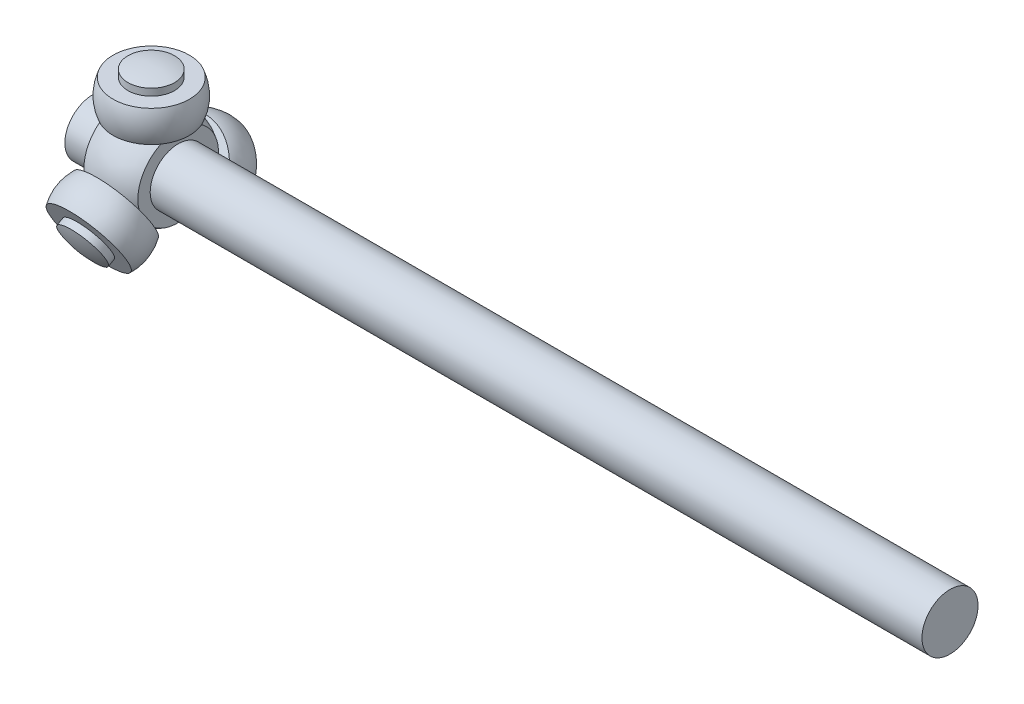
ISO-10303-21;
HEADER;
FILE_DESCRIPTION(('STEP AP214'),'2;1');
FILE_NAME('part.step','',(''),(''),'','','');
FILE_SCHEMA(('AUTOMOTIVE_DESIGN { 1 0 10303 214 1 1 1 1 }'));
ENDSEC;
DATA;
#1=APPLICATION_CONTEXT('core data for automotive mechanical design processes');
#2=APPLICATION_PROTOCOL_DEFINITION('international standard','automotive_design',2000,#1);
#3=PRODUCT_CONTEXT('',#1,'mechanical');
#4=PRODUCT('Part','Part','',(#3));
#5=PRODUCT_RELATED_PRODUCT_CATEGORY('part','',(#4));
#6=PRODUCT_DEFINITION_FORMATION('','',#4);
#7=PRODUCT_DEFINITION_CONTEXT('part definition',#1,'design');
#8=PRODUCT_DEFINITION('design','',#6,#7);
#9=PRODUCT_DEFINITION_SHAPE('','',#8);
#10=(LENGTH_UNIT() NAMED_UNIT(*) SI_UNIT(.MILLI.,.METRE.));
#11=(NAMED_UNIT(*) PLANE_ANGLE_UNIT() SI_UNIT($,.RADIAN.));
#12=(NAMED_UNIT(*) SI_UNIT($,.STERADIAN.) SOLID_ANGLE_UNIT());
#13=UNCERTAINTY_MEASURE_WITH_UNIT(LENGTH_MEASURE(1.E-05),#10,'distance_accuracy_value','');
#14=(GEOMETRIC_REPRESENTATION_CONTEXT(3) GLOBAL_UNCERTAINTY_ASSIGNED_CONTEXT((#13)) GLOBAL_UNIT_ASSIGNED_CONTEXT((#10,
#11,#12)) REPRESENTATION_CONTEXT('',''));
#15=CARTESIAN_POINT('',(0.,0.,0.));
#16=DIRECTION('',(0.,0.,1.));
#17=DIRECTION('',(1.,0.,0.));
#18=AXIS2_PLACEMENT_3D('',#15,#16,#17);
#19=CARTESIAN_POINT('',(0.,0.,0.));
#20=DIRECTION('',(-1.,0.,0.));
#21=DIRECTION('',(0.,1.,0.));
#22=AXIS2_PLACEMENT_3D('',#19,#20,#21);
#23=SPHERICAL_SURFACE('',#22,15.5769230769231);
#24=CARTESIAN_POINT('',(0.,-6.55500000000005,-11.353593043614));
#25=DIRECTION('',(0.,-0.500000000000004,-0.866025403784436));
#26=DIRECTION('',(0.,0.866025403784436,-0.500000000000004));
#27=AXIS2_PLACEMENT_3D('',#24,#25,#26);
#28=CIRCLE('',#27,8.41239755030506);
#29=CARTESIAN_POINT('',(0.,0.730349985298088,-15.5597918187665));
#30=VERTEX_POINT('',#29);
#31=EDGE_CURVE('E73',#30,#30,#28,.T.);
#32=ORIENTED_EDGE('',*,*,#31,.F.);
#33=EDGE_LOOP('',(#32));
#34=FACE_BOUND('',#33,.T.);
#35=CARTESIAN_POINT('',(0.,-6.55499999999989,11.353593043614));
#36=DIRECTION('',(0.,-0.499999999999992,0.866025403784443));
#37=DIRECTION('',(0.,-0.866025403784443,-0.499999999999992));
#38=AXIS2_PLACEMENT_3D('',#35,#36,#37);
#39=CIRCLE('',#38,8.41239755030507);
#40=CARTESIAN_POINT('',(0.,-13.8403499852981,7.14739426846158));
#41=VERTEX_POINT('',#40);
#42=EDGE_CURVE('E85',#41,#41,#39,.T.);
#43=ORIENTED_EDGE('',*,*,#42,.F.);
#44=EDGE_LOOP('',(#43));
#45=FACE_BOUND('',#44,.T.);
#46=CARTESIAN_POINT('',(0.,13.11,0.));
#47=DIRECTION('',(0.,1.,0.));
#48=DIRECTION('',(0.,0.,1.));
#49=AXIS2_PLACEMENT_3D('',#46,#47,#48);
#50=CIRCLE('',#49,8.41239755030507);
#51=CARTESIAN_POINT('',(0.,13.11,8.41239755030507));
#52=VERTEX_POINT('',#51);
#53=EDGE_CURVE('E55',#52,#52,#50,.T.);
#54=ORIENTED_EDGE('',*,*,#53,.F.);
#55=EDGE_LOOP('',(#54));
#56=FACE_BOUND('',#55,.T.);
#57=CARTESIAN_POINT('',(-8.65384615384615,0.,0.));
#58=DIRECTION('',(-1.,0.,0.));
#59=DIRECTION('',(0.,0.,1.));
#60=AXIS2_PLACEMENT_3D('',#57,#58,#59);
#61=CIRCLE('',#60,12.9518909542175);
#62=CARTESIAN_POINT('',(-8.65384615384615,0.,12.9518909542175));
#63=VERTEX_POINT('',#62);
#64=EDGE_CURVE('E11',#63,#63,#61,.T.);
#65=ORIENTED_EDGE('',*,*,#64,.F.);
#66=EDGE_LOOP('',(#65));
#67=FACE_BOUND('',#66,.T.);
#68=CARTESIAN_POINT('',(8.65384615384615,0.,0.));
#69=DIRECTION('',(-1.,0.,0.));
#70=DIRECTION('',(0.,0.,1.));
#71=AXIS2_PLACEMENT_3D('',#68,#69,#70);
#72=CIRCLE('',#71,12.9518909542175);
#73=CARTESIAN_POINT('',(8.65384615384615,0.,12.9518909542175));
#74=VERTEX_POINT('',#73);
#75=EDGE_CURVE('E46',#74,#74,#72,.T.);
#76=ORIENTED_EDGE('',*,*,#75,.T.);
#77=EDGE_LOOP('',(#76));
#78=FACE_BOUND('',#77,.T.);
#79=ADVANCED_FACE('F36',(#34,#45,#56,#67,#78),#23,.T.);
#80=CARTESIAN_POINT('',(-8.65384615384616,12.9518909542175,0.));
#81=DIRECTION('',(1.,0.,0.));
#82=DIRECTION('',(0.,0.,-1.));
#83=AXIS2_PLACEMENT_3D('',#80,#81,#82);
#84=PLANE('',#83);
#85=CARTESIAN_POINT('',(-8.65384615384615,0.,0.));
#86=DIRECTION('',(-1.,0.,0.));
#87=DIRECTION('',(0.,0.,1.));
#88=AXIS2_PLACEMENT_3D('',#85,#86,#87);
#89=CIRCLE('',#88,9.);
#90=CARTESIAN_POINT('',(-8.65384615384615,0.,9.));
#91=VERTEX_POINT('',#90);
#92=EDGE_CURVE('E42',#91,#91,#89,.T.);
#93=ORIENTED_EDGE('',*,*,#92,.F.);
#94=EDGE_LOOP('',(#93));
#95=FACE_BOUND('',#94,.T.);
#96=ORIENTED_EDGE('',*,*,#64,.T.);
#97=EDGE_LOOP('',(#96));
#98=FACE_BOUND('',#97,.T.);
#99=ADVANCED_FACE('F123',(#95,#98),#84,.F.);
#100=CARTESIAN_POINT('',(8.65384615384616,9.,0.));
#101=DIRECTION('',(-1.,0.,0.));
#102=DIRECTION('',(0.,0.,1.));
#103=AXIS2_PLACEMENT_3D('',#100,#101,#102);
#104=PLANE('',#103);
#105=ORIENTED_EDGE('',*,*,#75,.F.);
#106=EDGE_LOOP('',(#105));
#107=FACE_BOUND('',#106,.T.);
#108=CARTESIAN_POINT('',(8.65384615384615,0.,0.));
#109=DIRECTION('',(-1.,0.,0.));
#110=DIRECTION('',(0.,0.,1.));
#111=AXIS2_PLACEMENT_3D('',#108,#109,#110);
#112=CIRCLE('',#111,9.);
#113=CARTESIAN_POINT('',(8.65384615384615,0.,9.));
#114=VERTEX_POINT('',#113);
#115=EDGE_CURVE('E97',#114,#114,#112,.T.);
#116=ORIENTED_EDGE('',*,*,#115,.T.);
#117=EDGE_LOOP('',(#116));
#118=FACE_BOUND('',#117,.T.);
#119=ADVANCED_FACE('F128',(#107,#118),#104,.F.);
#120=CARTESIAN_POINT('',(0.,13.11,-7.47850270471022));
#121=DIRECTION('',(0.,1.,0.));
#122=DIRECTION('',(0.,0.,1.));
#123=AXIS2_PLACEMENT_3D('',#120,#121,#122);
#124=PLANE('',#123);
#125=CARTESIAN_POINT('',(0.,13.11,0.));
#126=DIRECTION('',(0.,1.,0.));
#127=DIRECTION('',(0.,0.,1.));
#128=AXIS2_PLACEMENT_3D('',#125,#126,#127);
#129=CIRCLE('',#128,12.2540156683432);
#130=CARTESIAN_POINT('',(0.,13.11,-12.2540156683432));
#131=VERTEX_POINT('',#130);
#132=EDGE_CURVE('E58',#131,#131,#129,.T.);
#133=ORIENTED_EDGE('',*,*,#132,.F.);
#134=EDGE_LOOP('',(#133));
#135=FACE_BOUND('',#134,.T.);
#136=ORIENTED_EDGE('',*,*,#53,.T.);
#137=EDGE_LOOP('',(#136));
#138=FACE_BOUND('',#137,.T.);
#139=ADVANCED_FACE('F141',(#135,#138),#124,.F.);
#140=CARTESIAN_POINT('',(0.,18.15,0.));
#141=DIRECTION('',(0.,1.,0.));
#142=DIRECTION('',(0.,0.,-1.));
#143=AXIS2_PLACEMENT_3D('',#140,#141,#142);
#144=SPHERICAL_SURFACE('',#143,13.25);
#145=CARTESIAN_POINT('',(0.,23.19,0.));
#146=DIRECTION('',(0.,1.,0.));
#147=DIRECTION('',(0.,0.,1.));
#148=AXIS2_PLACEMENT_3D('',#145,#146,#147);
#149=CIRCLE('',#148,12.2540156683432);
#150=CARTESIAN_POINT('',(0.,23.19,-12.2540156683432));
#151=VERTEX_POINT('',#150);
#152=EDGE_CURVE('E61',#151,#151,#149,.T.);
#153=CARTESIAN_POINT('',(0.,23.19,-12.2540156683432));
#154=CARTESIAN_POINT('',(0.,23.0903840691902,-12.2949873808712));
#155=CARTESIAN_POINT('',(0.,22.9902683386837,-12.3347438730989));
#156=CARTESIAN_POINT('',(0.,22.7890972612106,-12.4118039229785));
#157=CARTESIAN_POINT('',(0.,22.688041914244,-12.4491074806305));
#158=CARTESIAN_POINT('',(0.,22.4850515867848,-12.5212391673838));
#159=CARTESIAN_POINT('',(0.,22.3831166062921,-12.5560672964851));
#160=CARTESIAN_POINT('',(0.,22.1784276675977,-12.6232274952789));
#161=CARTESIAN_POINT('',(0.,22.075673709396,-12.6555595649714));
#162=CARTESIAN_POINT('',(0.,21.8694079180531,-12.7177083938399));
#163=CARTESIAN_POINT('',(0.,21.7658960849119,-12.7475251530158));
#164=CARTESIAN_POINT('',(0.,21.5581761079436,-12.8046256337488));
#165=CARTESIAN_POINT('',(0.,21.4539679641166,-12.8319093553057));
#166=CARTESIAN_POINT('',(0.,21.2449173412693,-12.8839275326611));
#167=CARTESIAN_POINT('',(0.,21.140074862249,-12.9086619884596));
#168=CARTESIAN_POINT('',(0.,20.9298179225403,-12.9555669243079));
#169=CARTESIAN_POINT('',(0.,20.8244034618518,-12.9777374043577));
#170=CARTESIAN_POINT('',(0.,20.6130652523017,-13.0195012030616));
#171=CARTESIAN_POINT('',(0.,20.5071415034401,-13.0390945217157));
#172=CARTESIAN_POINT('',(0.,20.2948477139849,-13.0756923448507));
#173=CARTESIAN_POINT('',(0.,20.1884776733914,-13.0926968493315));
#174=CARTESIAN_POINT('',(0.,19.9753545623237,-13.1241069309589));
#175=CARTESIAN_POINT('',(0.,19.8686014918495,-13.1385125081054));
#176=CARTESIAN_POINT('',(0.,19.6547758106764,-13.1647161675831));
#177=CARTESIAN_POINT('',(0.,19.5477031999776,-13.1765142499144));
#178=CARTESIAN_POINT('',(0.,19.3333021180514,-13.1974959030431));
#179=CARTESIAN_POINT('',(0.,19.2259736468242,-13.2066794738407));
#180=CARTESIAN_POINT('',(0.,19.0111246757067,-13.2224266421226));
#181=CARTESIAN_POINT('',(0.,18.9036041758166,-13.228990239607));
#182=CARTESIAN_POINT('',(0.,18.6884350934446,-13.2394935576695));
#183=CARTESIAN_POINT('',(0.,18.5807865109628,-13.2434332782476));
#184=CARTESIAN_POINT('',(0.,18.365425285654,-13.2486864994129));
#185=CARTESIAN_POINT('',(0.,18.257712642827,-13.25));
#186=CARTESIAN_POINT('',(0.,18.042287357173,-13.25));
#187=CARTESIAN_POINT('',(0.,17.934574714346,-13.2486864994129));
#188=CARTESIAN_POINT('',(0.,17.7192134890372,-13.2434332782476));
#189=CARTESIAN_POINT('',(0.,17.6115649065554,-13.2394935576695));
#190=CARTESIAN_POINT('',(0.,17.3963958241834,-13.228990239607));
#191=CARTESIAN_POINT('',(0.,17.2888753242933,-13.2224266421226));
#192=CARTESIAN_POINT('',(0.,17.0740263531758,-13.2066794738407));
#193=CARTESIAN_POINT('',(0.,16.9666978819486,-13.1974959030431));
#194=CARTESIAN_POINT('',(0.,16.7522968000224,-13.1765142499144));
#195=CARTESIAN_POINT('',(0.,16.6452241893236,-13.1647161675831));
#196=CARTESIAN_POINT('',(0.,16.4313985081505,-13.1385125081054));
#197=CARTESIAN_POINT('',(0.,16.3246454376763,-13.1241069309589));
#198=CARTESIAN_POINT('',(0.,16.1115223266086,-13.0926968493315));
#199=CARTESIAN_POINT('',(0.,16.0051522860151,-13.0756923448507));
#200=CARTESIAN_POINT('',(0.,15.7928584965599,-13.0390945217157));
#201=CARTESIAN_POINT('',(0.,15.6869347476983,-13.0195012030616));
#202=CARTESIAN_POINT('',(0.,15.4755965381482,-12.9777374043577));
#203=CARTESIAN_POINT('',(0.,15.3701820774597,-12.9555669243079));
#204=CARTESIAN_POINT('',(0.,15.159925137751,-12.9086619884596));
#205=CARTESIAN_POINT('',(0.,15.0550826587307,-12.8839275326611));
#206=CARTESIAN_POINT('',(0.,14.8460320358834,-12.8319093553057));
#207=CARTESIAN_POINT('',(0.,14.7418238920564,-12.8046256337487));
#208=CARTESIAN_POINT('',(0.,14.5341039150881,-12.7475251530158));
#209=CARTESIAN_POINT('',(0.,14.4305920819469,-12.7177083938398));
#210=CARTESIAN_POINT('',(0.,14.224326290604,-12.6555595649714));
#211=CARTESIAN_POINT('',(0.,14.1215723324023,-12.6232274952789));
#212=CARTESIAN_POINT('',(0.,13.9168833937079,-12.5560672964851));
#213=CARTESIAN_POINT('',(0.,13.8149484132152,-12.5212391673838));
#214=CARTESIAN_POINT('',(0.,13.6119580857559,-12.4491074806305));
#215=CARTESIAN_POINT('',(0.,13.5109027387894,-12.4118039229785));
#216=CARTESIAN_POINT('',(0.,13.3097316613163,-12.3347438730989));
#217=CARTESIAN_POINT('',(0.,13.2096159308098,-12.2949873808712));
#218=CARTESIAN_POINT('',(0.,13.11,-12.2540156683432));
#219=B_SPLINE_CURVE_WITH_KNOTS('',3,(#153,#154,#155,#156,#157,#158,#159,#160,#161,#162,#163,
#164,#165,#166,#167,#168,#169,#170,#171,#172,#173,#174,#175,#176,#177,#178,#179,#180,#181,#182,
#183,#184,#185,#186,#187,#188,#189,#190,#191,#192,#193,#194,#195,#196,#197,#198,#199,#200,#201,
#202,#203,#204,#205,#206,#207,#208,#209,#210,#211,#212,#213,#214,#215,#216,#217,#218),
.UNSPECIFIED.,.F.,.F.,(4,2,2,2,2,2,2,2,2,2,2,2,2,2,2,2,2,2,2,2,2,2,2,2,2,2,2,2,2,2,2,2,4),(0.,
0.323129921235588,0.646259842471182,0.969389763706772,1.29251968494236,1.61564960617796,
1.93877952741355,2.26190944864914,2.58503936988473,2.90816929112032,3.23129921235591,
3.5544291335915,3.87755905482709,4.20068897606268,4.52381889729827,4.84694881853386,
5.17007873976946,5.49320866100505,5.81633858224064,6.13946850347623,6.46259842471182,
6.78572834594741,7.10885826718301,7.4319881884186,7.75511810965419,8.07824803088978,
8.40137795212537,8.72450787336096,9.04763779459655,9.37076771583214,9.69389763706773,
10.0170275583033,10.3401574795389),.UNSPECIFIED.);
#220=EDGE_CURVE('BSEAM148',#151,#131,#219,.T.);
#221=ORIENTED_EDGE('',*,*,#152,.F.);
#222=ORIENTED_EDGE('',*,*,#132,.T.);
#223=ORIENTED_EDGE('',*,*,#220,.T.);
#224=ORIENTED_EDGE('',*,*,#220,.F.);
#225=EDGE_LOOP('',(#221,#223,#222,#224));
#226=FACE_BOUND('',#225,.T.);
#227=ADVANCED_FACE('F148',(#226),#144,.T.);
#228=CARTESIAN_POINT('',(0.,23.19,-7.47850270471022));
#229=DIRECTION('',(0.,-1.,0.));
#230=DIRECTION('',(0.,0.,-1.));
#231=AXIS2_PLACEMENT_3D('',#228,#229,#230);
#232=PLANE('',#231);
#233=CARTESIAN_POINT('',(0.,23.19,0.));
#234=DIRECTION('',(0.,1.,0.));
#235=DIRECTION('',(0.,0.,1.));
#236=AXIS2_PLACEMENT_3D('',#233,#234,#235);
#237=CIRCLE('',#236,7.47850270471022);
#238=CARTESIAN_POINT('',(0.,23.19,7.47850270471022));
#239=VERTEX_POINT('',#238);
#240=EDGE_CURVE('E64',#239,#239,#237,.T.);
#241=ORIENTED_EDGE('',*,*,#240,.F.);
#242=EDGE_LOOP('',(#241));
#243=FACE_BOUND('',#242,.T.);
#244=ORIENTED_EDGE('',*,*,#152,.T.);
#245=EDGE_LOOP('',(#244));
#246=FACE_BOUND('',#245,.T.);
#247=ADVANCED_FACE('F159',(#243,#246),#232,.F.);
#248=CARTESIAN_POINT('',(0.,0.,0.));
#249=DIRECTION('',(0.,-1.,0.));
#250=DIRECTION('',(0.,0.,-1.));
#251=AXIS2_PLACEMENT_3D('',#248,#249,#250);
#252=SPHERICAL_SURFACE('',#251,26.5);
#253=CARTESIAN_POINT('',(0.,25.4228636722074,0.));
#254=DIRECTION('',(0.,-1.,0.));
#255=DIRECTION('',(0.,0.,-1.));
#256=AXIS2_PLACEMENT_3D('',#253,#254,#255);
#257=CIRCLE('',#256,7.47850270471022);
#258=CARTESIAN_POINT('',(0.,25.4228636722074,-7.47850270471022));
#259=VERTEX_POINT('',#258);
#260=EDGE_CURVE('E50',#259,#259,#257,.T.);
#261=ORIENTED_EDGE('',*,*,#260,.F.);
#262=EDGE_LOOP('',(#261));
#263=FACE_BOUND('',#262,.T.);
#264=ADVANCED_FACE('F156',(#263),#252,.T.);
#265=CARTESIAN_POINT('',(0.,13.11,0.));
#266=DIRECTION('',(0.,1.,0.));
#267=DIRECTION('',(0.,0.,1.));
#268=AXIS2_PLACEMENT_3D('',#265,#266,#267);
#269=CYLINDRICAL_SURFACE('',#268,7.47850270471022);
#270=ORIENTED_EDGE('',*,*,#260,.T.);
#271=EDGE_LOOP('',(#270));
#272=FACE_BOUND('',#271,.T.);
#273=ORIENTED_EDGE('',*,*,#240,.T.);
#274=EDGE_LOOP('',(#273));
#275=FACE_BOUND('',#274,.T.);
#276=ADVANCED_FACE('F152',(#272,#275),#269,.T.);
#277=CARTESIAN_POINT('',(0.,-13.0315733245497,-7.61434169125882));
#278=DIRECTION('',(0.,-0.500000000000004,-0.866025403784436));
#279=DIRECTION('',(0.,0.866025403784436,-0.500000000000004));
#280=AXIS2_PLACEMENT_3D('',#277,#278,#279);
#281=PLANE('',#280);
#282=CARTESIAN_POINT('',(0.,-6.55500000000005,-11.353593043614));
#283=DIRECTION('',(0.,-0.500000000000004,-0.866025403784436));
#284=DIRECTION('',(0.,0.866025403784436,-0.500000000000004));
#285=AXIS2_PLACEMENT_3D('',#282,#283,#284);
#286=CIRCLE('',#285,12.2540156683432);
#287=CARTESIAN_POINT('',(0.,-17.1672888671578,-5.22658520944232));
#288=VERTEX_POINT('',#287);
#289=EDGE_CURVE('E76',#288,#288,#286,.T.);
#290=ORIENTED_EDGE('',*,*,#289,.F.);
#291=EDGE_LOOP('',(#290));
#292=FACE_BOUND('',#291,.T.);
#293=ORIENTED_EDGE('',*,*,#31,.T.);
#294=EDGE_LOOP('',(#293));
#295=FACE_BOUND('',#294,.T.);
#296=ADVANCED_FACE('F155',(#292,#295),#281,.F.);
#297=CARTESIAN_POINT('',(0.,-9.07500000000008,-15.7183610786875));
#298=DIRECTION('',(0.,-0.500000000000004,-0.866025403784436));
#299=DIRECTION('',(0.,-0.866025403784436,0.500000000000004));
#300=AXIS2_PLACEMENT_3D('',#297,#298,#299);
#301=SPHERICAL_SURFACE('',#300,13.25);
#302=CARTESIAN_POINT('',(0.,-11.5950000000001,-20.0831291137611));
#303=DIRECTION('',(0.,-0.500000000000004,-0.866025403784436));
#304=DIRECTION('',(0.,0.866025403784436,-0.500000000000004));
#305=AXIS2_PLACEMENT_3D('',#302,#303,#304);
#306=CIRCLE('',#305,12.2540156683432);
#307=CARTESIAN_POINT('',(0.,-22.2072888671578,-13.9561212795894));
#308=VERTEX_POINT('',#307);
#309=EDGE_CURVE('E79',#308,#308,#306,.T.);
#310=CARTESIAN_POINT('',(0.,-22.2072888671578,-13.9561212795894));
#311=CARTESIAN_POINT('',(0.,-22.1929634456387,-13.8493654966225));
#312=CARTESIAN_POINT('',(0.,-22.17733571262,-13.7427844845716));
#313=CARTESIAN_POINT('',(0.,-22.1434861346961,-13.5300351960334));
#314=CARTESIAN_POINT('',(0.,-22.125264289791,-13.4238669195461));
#315=CARTESIAN_POINT('',(0.,-22.0862369992076,-13.2120062958672));
#316=CARTESIAN_POINT('',(0.,-22.0654315535292,-13.1063139486756));
#317=CARTESIAN_POINT('',(0.,-22.0212495224607,-12.8954680284957));
#318=CARTESIAN_POINT('',(0.,-21.9978729370705,-12.7903144555074));
#319=CARTESIAN_POINT('',(0.,-21.9485625060145,-12.5806086258385));
#320=CARTESIAN_POINT('',(0.,-21.9226286603488,-12.476056369158));
#321=CARTESIAN_POINT('',(0.,-21.8682191387477,-12.2676153518634));
#322=CARTESIAN_POINT('',(0.,-21.8397434628123,-12.1637265912495));
#323=CARTESIAN_POINT('',(0.,-21.780267214437,-11.9566743525091));
#324=CARTESIAN_POINT('',(0.,-21.7492666419971,-11.8535108743825));
#325=CARTESIAN_POINT('',(0.,-21.6847590381502,-11.6479705553487));
#326=CARTESIAN_POINT('',(0.,-21.6512520067432,-11.5455937144413));
#327=CARTESIAN_POINT('',(0.,-21.5817514126043,-11.3416875568286));
#328=CARTESIAN_POINT('',(0.,-21.5457578498724,-11.2401582401233));
#329=CARTESIAN_POINT('',(0.,-21.4713055997029,-11.038007513822));
#330=CARTESIAN_POINT('',(0.,-21.4328469122653,-10.937386104226));
#331=CARTESIAN_POINT('',(0.,-21.3534872853557,-10.7371110350941));
#332=CARTESIAN_POINT('',(0.,-21.3125863458836,-10.6374573755583));
#333=CARTESIAN_POINT('',(0.,-21.228366540077,-10.439177073942));
#334=CARTESIAN_POINT('',(0.,-21.1850476737423,-10.3405504318616));
#335=CARTESIAN_POINT('',(0.,-21.0960177774022,-10.1443828217504));
#336=CARTESIAN_POINT('',(0.,-21.0503067473967,-10.0468418537194));
#337=CARTESIAN_POINT('',(0.,-20.9565197096078,-9.85290360261384));
#338=CARTESIAN_POINT('',(0.,-20.9084437018244,-9.75650631953916));
#339=CARTESIAN_POINT('',(0.,-20.8099553009045,-9.56491276906479));
#340=CARTESIAN_POINT('',(0.,-20.7595429077681,-9.4697165016651));
#341=CARTESIAN_POINT('',(0.,-20.6564117180946,-9.28058159897492));
#342=CARTESIAN_POINT('',(0.,-20.6036929215574,-9.18664296368442));
#343=CARTESIAN_POINT('',(0.,-20.4959802787303,-9.00007919369052));
#344=CARTESIAN_POINT('',(0.,-20.4409864324405,-8.90745405898712));
#345=CARTESIAN_POINT('',(0.,-20.3287563968053,-8.72357237746218));
#346=CARTESIAN_POINT('',(0.,-20.2715202074599,-8.63231583064065));
#347=CARTESIAN_POINT('',(0.,-20.1548395260078,-8.4512255982288));
#348=CARTESIAN_POINT('',(0.,-20.095395033901,-8.3613919126385));
#349=CARTESIAN_POINT('',(0.,-19.9743331005725,-8.1832008298148));
#350=CARTESIAN_POINT('',(0.,-19.9127156593507,-8.09484343258142));
#351=CARTESIAN_POINT('',(0.,-19.7873444737648,-7.91965747559893));
#352=CARTESIAN_POINT('',(0.,-19.7235907294005,-7.83282891584982));
#353=CARTESIAN_POINT('',(0.,-19.5939848540342,-7.66075227371131));
#354=CARTESIAN_POINT('',(0.,-19.528132723032,-7.57550419132192));
#355=CARTESIAN_POINT('',(0.,-19.3943692388739,-7.40663920381738));
#356=CARTESIAN_POINT('',(0.,-19.326457885718,-7.32302229870224));
#357=CARTESIAN_POINT('',(0.,-19.1886163464323,-7.15746939553588));
#358=CARTESIAN_POINT('',(0.,-19.1186861603026,-7.07553339748466));
#359=CARTESIAN_POINT('',(0.,-18.9768485448914,-6.91339103857592));
#360=CARTESIAN_POINT('',(0.,-18.90494111561,-6.83318467771839));
#361=CARTESIAN_POINT('',(0.,-18.7591917797481,-6.6745492945328));
#362=CARTESIAN_POINT('',(0.,-18.6853498731677,-6.59612027220474));
#363=CARTESIAN_POINT('',(0.,-18.5357754986957,-6.44108621081971));
#364=CARTESIAN_POINT('',(0.,-18.4600430308041,-6.36448117176274));
#365=CARTESIAN_POINT('',(0.,-18.3067325754369,-6.21314063520115));
#366=CARTESIAN_POINT('',(0.,-18.2291545879614,-6.13840513769654));
#367=CARTESIAN_POINT('',(0.,-18.0721992276744,-5.99084813689611));
#368=CARTESIAN_POINT('',(0.,-17.992821854863,-5.9180266336003));
#369=CARTESIAN_POINT('',(0.,-17.8323149472371,-5.77434091221418));
#370=CARTESIAN_POINT('',(0.,-17.7511854124227,-5.70347669412388));
#371=CARTESIAN_POINT('',(0.,-17.5872223755469,-5.56374775719832));
#372=CARTESIAN_POINT('',(0.,-17.5043888734855,-5.49488303836307));
#373=CARTESIAN_POINT('',(0.,-17.3370673739363,-5.3591937997045));
#374=CARTESIAN_POINT('',(0.,-17.2525793764485,-5.2923692798812));
#375=CARTESIAN_POINT('',(0.,-17.1672888671578,-5.22658520944232));
#376=B_SPLINE_CURVE_WITH_KNOTS('',3,(#310,#311,#312,#313,#314,#315,#316,#317,#318,#319,#320,
#321,#322,#323,#324,#325,#326,#327,#328,#329,#330,#331,#332,#333,#334,#335,#336,#337,#338,#339,
#340,#341,#342,#343,#344,#345,#346,#347,#348,#349,#350,#351,#352,#353,#354,#355,#356,#357,#358,
#359,#360,#361,#362,#363,#364,#365,#366,#367,#368,#369,#370,#371,#372,#373,#374,#375),
.UNSPECIFIED.,.F.,.F.,(4,2,2,2,2,2,2,2,2,2,2,2,2,2,2,2,2,2,2,2,2,2,2,2,2,2,2,2,2,2,2,2,4),(0.,
0.323129921235591,0.646259842471183,0.969389763706774,1.29251968494237,1.61564960617796,
1.93877952741355,2.26190944864914,2.58503936988473,2.90816929112032,3.23129921235591,
3.5544291335915,3.87755905482709,4.20068897606269,4.52381889729828,4.84694881853387,
5.17007873976946,5.49320866100505,5.81633858224064,6.13946850347623,6.46259842471182,
6.78572834594741,7.10885826718301,7.4319881884186,7.75511810965419,8.07824803088978,
8.40137795212537,8.72450787336096,9.04763779459655,9.37076771583214,9.69389763706773,
10.0170275583033,10.3401574795389),.UNSPECIFIED.);
#377=EDGE_CURVE('BSEAM189',#308,#288,#376,.T.);
#378=ORIENTED_EDGE('',*,*,#309,.F.);
#379=ORIENTED_EDGE('',*,*,#289,.T.);
#380=ORIENTED_EDGE('',*,*,#377,.T.);
#381=ORIENTED_EDGE('',*,*,#377,.F.);
#382=EDGE_LOOP('',(#378,#380,#379,#381));
#383=FACE_BOUND('',#382,.T.);
#384=ADVANCED_FACE('F189',(#383),#301,.T.);
#385=CARTESIAN_POINT('',(0.,-18.0715733245498,-16.3438777614059));
#386=DIRECTION('',(0.,0.500000000000004,0.866025403784436));
#387=DIRECTION('',(0.,-0.866025403784436,0.500000000000004));
#388=AXIS2_PLACEMENT_3D('',#385,#386,#387);
#389=PLANE('',#388);
#390=CARTESIAN_POINT('',(0.,-11.5950000000001,-20.0831291137611));
#391=DIRECTION('',(0.,-0.500000000000004,-0.866025403784436));
#392=DIRECTION('',(0.,0.866025403784436,-0.500000000000004));
#393=AXIS2_PLACEMENT_3D('',#390,#391,#392);
#394=CIRCLE('',#393,7.47850270471022);
#395=CARTESIAN_POINT('',(0.,-5.11842667545043,-23.8223804661162));
#396=VERTEX_POINT('',#395);
#397=EDGE_CURVE('E82',#396,#396,#394,.T.);
#398=ORIENTED_EDGE('',*,*,#397,.F.);
#399=EDGE_LOOP('',(#398));
#400=FACE_BOUND('',#399,.T.);
#401=ORIENTED_EDGE('',*,*,#309,.T.);
#402=EDGE_LOOP('',(#401));
#403=FACE_BOUND('',#402,.T.);
#404=ADVANCED_FACE('F181',(#400,#403),#389,.F.);
#405=CARTESIAN_POINT('',(0.,0.,0.));
#406=DIRECTION('',(0.,0.500000000000004,0.866025403784436));
#407=DIRECTION('',(0.,-0.866025403784436,0.500000000000004));
#408=AXIS2_PLACEMENT_3D('',#405,#406,#407);
#409=SPHERICAL_SURFACE('',#408,26.5);
#410=CARTESIAN_POINT('',(0.,-12.7114318361038,-22.0168457770801));
#411=DIRECTION('',(0.,0.500000000000004,0.866025403784436));
#412=DIRECTION('',(0.,-0.866025403784436,0.500000000000004));
#413=AXIS2_PLACEMENT_3D('',#410,#411,#412);
#414=CIRCLE('',#413,7.47850270471022);
#415=CARTESIAN_POINT('',(0.,-19.1880051606535,-18.2775944247249));
#416=VERTEX_POINT('',#415);
#417=EDGE_CURVE('E67',#416,#416,#414,.T.);
#418=ORIENTED_EDGE('',*,*,#417,.F.);
#419=EDGE_LOOP('',(#418));
#420=FACE_BOUND('',#419,.T.);
#421=ADVANCED_FACE('F172',(#420),#409,.T.);
#422=CARTESIAN_POINT('',(0.,-6.55500000000005,-11.353593043614));
#423=DIRECTION('',(0.,-0.500000000000004,-0.866025403784436));
#424=DIRECTION('',(0.,0.866025403784436,-0.500000000000004));
#425=AXIS2_PLACEMENT_3D('',#422,#423,#424);
#426=CYLINDRICAL_SURFACE('',#425,7.47850270471022);
#427=ORIENTED_EDGE('',*,*,#417,.T.);
#428=EDGE_LOOP('',(#427));
#429=FACE_BOUND('',#428,.T.);
#430=ORIENTED_EDGE('',*,*,#397,.T.);
#431=EDGE_LOOP('',(#430));
#432=FACE_BOUND('',#431,.T.);
#433=ADVANCED_FACE('F168',(#429,#432),#426,.T.);
#434=CARTESIAN_POINT('',(0.,-0.0784266754501753,15.0928443959691));
#435=DIRECTION('',(0.,-0.499999999999992,0.866025403784443));
#436=DIRECTION('',(0.,-0.866025403784443,-0.499999999999992));
#437=AXIS2_PLACEMENT_3D('',#434,#435,#436);
#438=PLANE('',#437);
#439=CARTESIAN_POINT('',(0.,-6.55499999999989,11.353593043614));
#440=DIRECTION('',(0.,-0.499999999999992,0.866025403784443));
#441=DIRECTION('',(0.,-0.866025403784443,-0.499999999999992));
#442=AXIS2_PLACEMENT_3D('',#439,#440,#441);
#443=CIRCLE('',#442,12.2540156683432);
#444=CARTESIAN_POINT('',(0.,4.05728886715789,17.4806008777855));
#445=VERTEX_POINT('',#444);
#446=EDGE_CURVE('E88',#445,#445,#443,.T.);
#447=ORIENTED_EDGE('',*,*,#446,.F.);
#448=EDGE_LOOP('',(#447));
#449=FACE_BOUND('',#448,.T.);
#450=ORIENTED_EDGE('',*,*,#42,.T.);
#451=EDGE_LOOP('',(#450));
#452=FACE_BOUND('',#451,.T.);
#453=ADVANCED_FACE('F171',(#449,#452),#438,.F.);
#454=CARTESIAN_POINT('',(0.,-9.07499999999986,15.7183610786876));
#455=DIRECTION('',(0.,-0.499999999999992,0.866025403784443));
#456=DIRECTION('',(0.,0.866025403784443,0.499999999999992));
#457=AXIS2_PLACEMENT_3D('',#454,#455,#456);
#458=SPHERICAL_SURFACE('',#457,13.25);
#459=CARTESIAN_POINT('',(0.,-11.5949999999998,20.0831291137612));
#460=DIRECTION('',(0.,-0.499999999999992,0.866025403784443));
#461=DIRECTION('',(0.,-0.866025403784443,-0.499999999999992));
#462=AXIS2_PLACEMENT_3D('',#459,#460,#461);
#463=CIRCLE('',#462,12.2540156683432);
#464=CARTESIAN_POINT('',(0.,-0.98271113284203,26.2101369479327));
#465=VERTEX_POINT('',#464);
#466=EDGE_CURVE('E91',#465,#465,#463,.T.);
#467=CARTESIAN_POINT('',(0.,-0.98271113284203,26.2101369479327));
#468=CARTESIAN_POINT('',(0.,-0.897420623551322,26.1443528774939));
#469=CARTESIAN_POINT('',(0.,-0.812932626063513,26.0775283576705));
#470=CARTESIAN_POINT('',(0.,-0.645611126514296,25.941839119012));
#471=CARTESIAN_POINT('',(0.,-0.562777624452889,25.8729744001767));
#472=CARTESIAN_POINT('',(0.,-0.398814587577081,25.7332454632512));
#473=CARTESIAN_POINT('',(0.,-0.31768505276268,25.6623812451609));
#474=CARTESIAN_POINT('',(0.,-0.157178145136839,25.5186955237747));
#475=CARTESIAN_POINT('',(0.,-0.0778007723253985,25.4458740204789));
#476=CARTESIAN_POINT('',(0.,0.0791545879615641,25.2983170196785));
#477=CARTESIAN_POINT('',(0.,0.156732575437087,25.2235815221739));
#478=CARTESIAN_POINT('',(0.,0.310043030804251,25.0722409856123));
#479=CARTESIAN_POINT('',(0.,0.385775498695893,24.9956359465553));
#480=CARTESIAN_POINT('',(0.,0.535349873167913,24.8406018851703));
#481=CARTESIAN_POINT('',(0.,0.609191779748292,24.7621728628422));
#482=CARTESIAN_POINT('',(0.,0.754941115610144,24.6035374796566));
#483=CARTESIAN_POINT('',(0.,0.826848544891618,24.5233311187991));
#484=CARTESIAN_POINT('',(0.,0.968686160302808,24.3611887598904));
#485=CARTESIAN_POINT('',(0.,1.03861634643252,24.2792527618391));
#486=CARTESIAN_POINT('',(0.,1.17645788571818,24.1136998586728));
#487=CARTESIAN_POINT('',(0.,1.24436923887412,24.0300829535576));
#488=CARTESIAN_POINT('',(0.,1.3781327230322,23.8612179660531));
#489=CARTESIAN_POINT('',(0.,1.44398485403433,23.7759698836637));
#490=CARTESIAN_POINT('',(0.,1.5735907294007,23.6038932415252));
#491=CARTESIAN_POINT('',(0.,1.63734447376494,23.5170646817761));
#492=CARTESIAN_POINT('',(0.,1.76271565935092,23.3418787247936));
#493=CARTESIAN_POINT('',(0.,1.82433310057267,23.2535213275602));
#494=CARTESIAN_POINT('',(0.,1.94539503390118,23.0753302447365));
#495=CARTESIAN_POINT('',(0.,2.00483952600796,22.9854965591462));
#496=CARTESIAN_POINT('',(0.,2.12152020746011,22.8044063267344));
#497=CARTESIAN_POINT('',(0.,2.17875639680549,22.7131497799128));
#498=CARTESIAN_POINT('',(0.,2.29098643244069,22.5292680983879));
#499=CARTESIAN_POINT('',(0.,2.34598027873051,22.4366429636845));
#500=CARTESIAN_POINT('',(0.,2.45369292155752,22.2500791936906));
#501=CARTESIAN_POINT('',(0.,2.50641171809471,22.1561405584001));
#502=CARTESIAN_POINT('',(0.,2.6095429077683,21.9670056557099));
#503=CARTESIAN_POINT('',(0.,2.6599553009047,21.8718093883102));
#504=CARTESIAN_POINT('',(0.,2.75844370182451,21.6802158378358));
#505=CARTESIAN_POINT('',(0.,2.80651970960791,21.5838185547612));
#506=CARTESIAN_POINT('',(0.,2.90030674739682,21.3898803036555));
#507=CARTESIAN_POINT('',(0.,2.94601777740233,21.2923393356246));
#508=CARTESIAN_POINT('',(0.,3.03504767374247,21.0961717255133));
#509=CARTESIAN_POINT('',(0.,3.07836654007709,20.997545083433));
#510=CARTESIAN_POINT('',(0.,3.16258634588378,20.7992647818167));
#511=CARTESIAN_POINT('',(0.,3.20348728535583,20.6996111222808));
#512=CARTESIAN_POINT('',(0.,3.28284691226546,20.499336053149));
#513=CARTESIAN_POINT('',(0.,3.32130559970304,20.398714643553));
#514=CARTESIAN_POINT('',(0.,3.39575784987254,20.1965639172517));
#515=CARTESIAN_POINT('',(0.,3.43175141260446,20.0950346005463));
#516=CARTESIAN_POINT('',(0.,3.50125200674337,19.8911284429337));
#517=CARTESIAN_POINT('',(0.,3.53475903815036,19.7887516020263));
#518=CARTESIAN_POINT('',(0.,3.59926664199723,19.5832112829924));
#519=CARTESIAN_POINT('',(0.,3.63026721443712,19.4800478048659));
#520=CARTESIAN_POINT('',(0.,3.68974346281242,19.2729955661255));
#521=CARTESIAN_POINT('',(0.,3.71821913874783,19.1691068055115));
#522=CARTESIAN_POINT('',(0.,3.77262866034895,18.960665788217));
#523=CARTESIAN_POINT('',(0.,3.79856250601465,18.8561135315364));
#524=CARTESIAN_POINT('',(0.,3.84787293707058,18.6464077018676));
#525=CARTESIAN_POINT('',(0.,3.87124952246081,18.5412541288793));
#526=CARTESIAN_POINT('',(0.,3.91543155352935,18.3304082086994));
#527=CARTESIAN_POINT('',(0.,3.93623699920767,18.2247158615077));
#528=CARTESIAN_POINT('',(0.,3.97526428979109,18.0128552378289));
#529=CARTESIAN_POINT('',(0.,3.99348613469619,17.9066869613416));
#530=CARTESIAN_POINT('',(0.,4.02733571262007,17.6939376728034));
#531=CARTESIAN_POINT('',(0.,4.04296344563884,17.5873566607524));
#532=CARTESIAN_POINT('',(0.,4.05728886715789,17.4806008777855));
#533=B_SPLINE_CURVE_WITH_KNOTS('',3,(#467,#468,#469,#470,#471,#472,#473,#474,#475,#476,#477,
#478,#479,#480,#481,#482,#483,#484,#485,#486,#487,#488,#489,#490,#491,#492,#493,#494,#495,#496,
#497,#498,#499,#500,#501,#502,#503,#504,#505,#506,#507,#508,#509,#510,#511,#512,#513,#514,#515,
#516,#517,#518,#519,#520,#521,#522,#523,#524,#525,#526,#527,#528,#529,#530,#531,#532),
.UNSPECIFIED.,.F.,.F.,(4,2,2,2,2,2,2,2,2,2,2,2,2,2,2,2,2,2,2,2,2,2,2,2,2,2,2,2,2,2,2,2,4),(0.,
0.323129921235594,0.646259842471185,0.969389763706776,1.29251968494237,1.61564960617796,
1.93877952741355,2.26190944864914,2.58503936988473,2.90816929112032,3.23129921235592,
3.55442913359151,3.8775590548271,4.20068897606269,4.52381889729828,4.84694881853387,
5.17007873976946,5.49320866100505,5.81633858224065,6.13946850347624,6.46259842471183,
6.78572834594742,7.10885826718301,7.4319881884186,7.75511810965419,8.07824803088979,
8.40137795212538,8.72450787336097,9.04763779459656,9.37076771583215,9.69389763706774,
10.0170275583033,10.3401574795389),.UNSPECIFIED.);
#534=EDGE_CURVE('BSEAM199',#465,#445,#533,.T.);
#535=ORIENTED_EDGE('',*,*,#466,.F.);
#536=ORIENTED_EDGE('',*,*,#446,.T.);
#537=ORIENTED_EDGE('',*,*,#534,.T.);
#538=ORIENTED_EDGE('',*,*,#534,.F.);
#539=EDGE_LOOP('',(#535,#537,#536,#538));
#540=FACE_BOUND('',#539,.T.);
#541=ADVANCED_FACE('F199',(#540),#458,.T.);
#542=CARTESIAN_POINT('',(0.,-5.1184266754501,23.8223804661163));
#543=DIRECTION('',(0.,0.499999999999992,-0.866025403784443));
#544=DIRECTION('',(0.,0.866025403784443,0.499999999999992));
#545=AXIS2_PLACEMENT_3D('',#542,#543,#544);
#546=PLANE('',#545);
#547=CARTESIAN_POINT('',(0.,-11.5949999999998,20.0831291137612));
#548=DIRECTION('',(0.,-0.499999999999992,0.866025403784443));
#549=DIRECTION('',(0.,-0.866025403784443,-0.499999999999992));
#550=AXIS2_PLACEMENT_3D('',#547,#548,#549);
#551=CIRCLE('',#550,7.47850270471022);
#552=CARTESIAN_POINT('',(0.,-18.0715733245495,16.3438777614062));
#553=VERTEX_POINT('',#552);
#554=EDGE_CURVE('E94',#553,#553,#551,.T.);
#555=ORIENTED_EDGE('',*,*,#554,.F.);
#556=EDGE_LOOP('',(#555));
#557=FACE_BOUND('',#556,.T.);
#558=ORIENTED_EDGE('',*,*,#466,.T.);
#559=EDGE_LOOP('',(#558));
#560=FACE_BOUND('',#559,.T.);
#561=ADVANCED_FACE('F185',(#557,#560),#546,.F.);
#562=CARTESIAN_POINT('',(0.,0.,0.));
#563=DIRECTION('',(0.,0.499999999999992,-0.866025403784443));
#564=DIRECTION('',(0.,0.866025403784443,0.499999999999992));
#565=AXIS2_PLACEMENT_3D('',#562,#563,#564);
#566=SPHERICAL_SURFACE('',#565,26.5);
#567=CARTESIAN_POINT('',(0.,-12.7114318361035,22.0168457770803));
#568=DIRECTION('',(0.,0.499999999999992,-0.866025403784443));
#569=DIRECTION('',(0.,0.866025403784443,0.499999999999992));
#570=AXIS2_PLACEMENT_3D('',#567,#568,#569);
#571=CIRCLE('',#570,7.47850270471022);
#572=CARTESIAN_POINT('',(0.,-6.23485851155377,25.7560971294353));
#573=VERTEX_POINT('',#572);
#574=EDGE_CURVE('E70',#573,#573,#571,.T.);
#575=ORIENTED_EDGE('',*,*,#574,.F.);
#576=EDGE_LOOP('',(#575));
#577=FACE_BOUND('',#576,.T.);
#578=ADVANCED_FACE('F177',(#577),#566,.T.);
#579=CARTESIAN_POINT('',(0.,-6.55499999999989,11.3535930436141));
#580=DIRECTION('',(0.,-0.499999999999992,0.866025403784443));
#581=DIRECTION('',(0.,-0.866025403784443,-0.499999999999992));
#582=AXIS2_PLACEMENT_3D('',#579,#580,#581);
#583=CYLINDRICAL_SURFACE('',#582,7.47850270471022);
#584=ORIENTED_EDGE('',*,*,#574,.T.);
#585=EDGE_LOOP('',(#584));
#586=FACE_BOUND('',#585,.T.);
#587=ORIENTED_EDGE('',*,*,#554,.T.);
#588=EDGE_LOOP('',(#587));
#589=FACE_BOUND('',#588,.T.);
#590=ADVANCED_FACE('F174',(#586,#589),#583,.T.);
#591=CARTESIAN_POINT('',(256.346153846154,0.,0.));
#592=DIRECTION('',(-1.,0.,0.));
#593=DIRECTION('',(0.,0.,1.));
#594=AXIS2_PLACEMENT_3D('',#591,#592,#593);
#595=PLANE('',#594);
#596=CARTESIAN_POINT('',(256.346153846154,0.,0.));
#597=DIRECTION('',(-1.,0.,0.));
#598=DIRECTION('',(0.,0.,1.));
#599=AXIS2_PLACEMENT_3D('',#596,#597,#598);
#600=CIRCLE('',#599,9.);
#601=CARTESIAN_POINT('',(256.346153846154,0.,9.));
#602=VERTEX_POINT('',#601);
#603=EDGE_CURVE('E100',#602,#602,#600,.T.);
#604=ORIENTED_EDGE('',*,*,#603,.F.);
#605=EDGE_LOOP('',(#604));
#606=FACE_BOUND('',#605,.T.);
#607=ADVANCED_FACE('F118',(#606),#595,.F.);
#608=CARTESIAN_POINT('',(256.346153846154,0.,0.));
#609=DIRECTION('',(-1.,0.,0.));
#610=DIRECTION('',(0.,0.,1.));
#611=AXIS2_PLACEMENT_3D('',#608,#609,#610);
#612=CYLINDRICAL_SURFACE('',#611,9.);
#613=ORIENTED_EDGE('',*,*,#603,.T.);
#614=EDGE_LOOP('',(#613));
#615=FACE_BOUND('',#614,.T.);
#616=ORIENTED_EDGE('',*,*,#115,.F.);
#617=EDGE_LOOP('',(#616));
#618=FACE_BOUND('',#617,.T.);
#619=ADVANCED_FACE('F111',(#615,#618),#612,.T.);
#620=CARTESIAN_POINT('',(-18.7338461538462,0.,0.));
#621=DIRECTION('',(-1.,0.,0.));
#622=DIRECTION('',(0.,0.,1.));
#623=AXIS2_PLACEMENT_3D('',#620,#621,#622);
#624=CIRCLE('',#623,9.);
#625=CARTESIAN_POINT('',(-18.7338461538462,0.,9.));
#626=VERTEX_POINT('',#625);
#627=EDGE_CURVE('E103',#626,#626,#624,.T.);
#628=ORIENTED_EDGE('',*,*,#627,.F.);
#629=EDGE_LOOP('',(#628));
#630=FACE_BOUND('',#629,.T.);
#631=ORIENTED_EDGE('',*,*,#92,.T.);
#632=EDGE_LOOP('',(#631));
#633=FACE_BOUND('',#632,.T.);
#634=ADVANCED_FACE('F109',(#630,#633),#612,.T.);
#635=CARTESIAN_POINT('',(-18.7338461538462,0.,0.));
#636=DIRECTION('',(-1.,0.,0.));
#637=DIRECTION('',(0.,0.,1.));
#638=AXIS2_PLACEMENT_3D('',#635,#636,#637);
#639=PLANE('',#638);
#640=ORIENTED_EDGE('',*,*,#627,.T.);
#641=EDGE_LOOP('',(#640));
#642=FACE_BOUND('',#641,.T.);
#643=ADVANCED_FACE('F107',(#642),#639,.T.);
#644=CLOSED_SHELL('',(#79,#99,#119,#139,#227,#247,#264,#276,#296,#384,#404,#421,#433,#453,#541,
#561,#578,#590,#607,#619,#634,#643));
#645=MANIFOLD_SOLID_BREP('B2',#644);
#646=ADVANCED_BREP_SHAPE_REPRESENTATION('',(#18,#645),#14);
#647=SHAPE_DEFINITION_REPRESENTATION(#9,#646);
ENDSEC;
END-ISO-10303-21;
